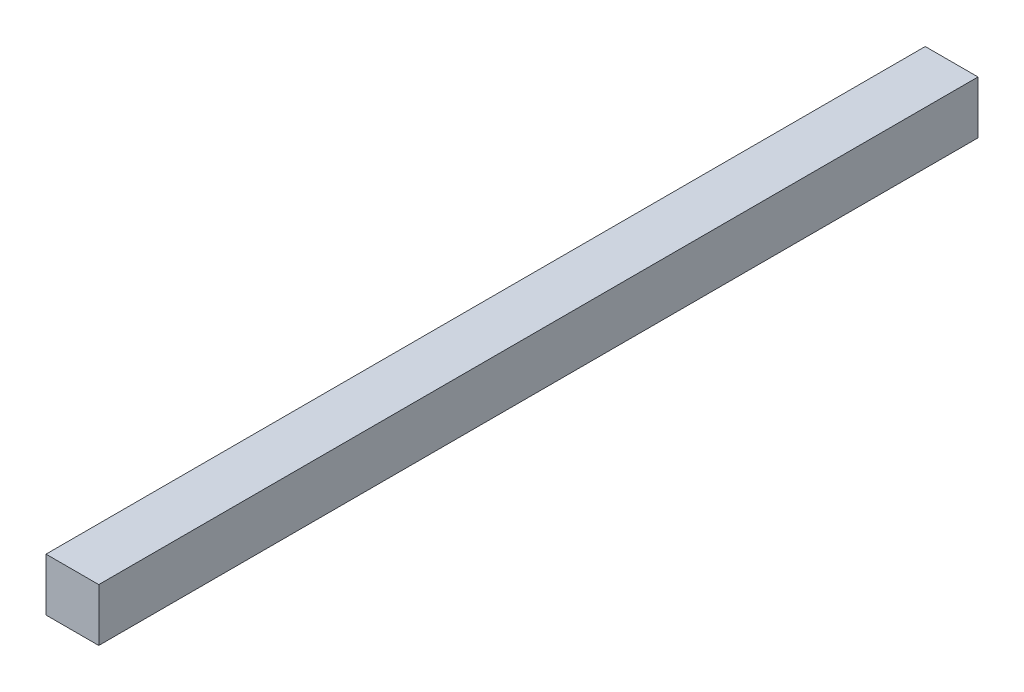
ISO-10303-21;
HEADER;
FILE_DESCRIPTION(('STEP AP214'),'2;1');
FILE_NAME('part.step','',(''),(''),'','','');
FILE_SCHEMA(('AUTOMOTIVE_DESIGN { 1 0 10303 214 1 1 1 1 }'));
ENDSEC;
DATA;
#1=APPLICATION_CONTEXT('core data for automotive mechanical design processes');
#2=APPLICATION_PROTOCOL_DEFINITION('international standard','automotive_design',2000,#1);
#3=PRODUCT_CONTEXT('',#1,'mechanical');
#4=PRODUCT('Part','Part','',(#3));
#5=PRODUCT_RELATED_PRODUCT_CATEGORY('part','',(#4));
#6=PRODUCT_DEFINITION_FORMATION('','',#4);
#7=PRODUCT_DEFINITION_CONTEXT('part definition',#1,'design');
#8=PRODUCT_DEFINITION('design','',#6,#7);
#9=PRODUCT_DEFINITION_SHAPE('','',#8);
#10=(LENGTH_UNIT() NAMED_UNIT(*) SI_UNIT(.MILLI.,.METRE.));
#11=(NAMED_UNIT(*) PLANE_ANGLE_UNIT() SI_UNIT($,.RADIAN.));
#12=(NAMED_UNIT(*) SI_UNIT($,.STERADIAN.) SOLID_ANGLE_UNIT());
#13=UNCERTAINTY_MEASURE_WITH_UNIT(LENGTH_MEASURE(1.E-05),#10,'distance_accuracy_value','');
#14=(GEOMETRIC_REPRESENTATION_CONTEXT(3) GLOBAL_UNCERTAINTY_ASSIGNED_CONTEXT((#13)) GLOBAL_UNIT_ASSIGNED_CONTEXT((#10,
#11,#12)) REPRESENTATION_CONTEXT('',''));
#15=CARTESIAN_POINT('',(0.,0.,0.));
#16=DIRECTION('',(0.,0.,1.));
#17=DIRECTION('',(1.,0.,0.));
#18=AXIS2_PLACEMENT_3D('',#15,#16,#17);
#19=CARTESIAN_POINT('',(-19.5762350936968,22.7172061328773,500.));
#20=DIRECTION('',(1.,0.,0.));
#21=DIRECTION('',(0.,1.,0.));
#22=AXIS2_PLACEMENT_3D('',#19,#20,#21);
#23=PLANE('',#22);
#24=DIRECTION('',(0.,-1.,0.));
#25=VECTOR('',#24,1.);
#26=CARTESIAN_POINT('',(-19.5762350936968,22.7172061328773,0.));
#27=LINE('',#26,#25);
#28=CARTESIAN_POINT('',(-19.5762350936968,22.7172061328773,0.));
#29=VERTEX_POINT('',#28);
#30=CARTESIAN_POINT('',(-19.5762350936968,-7.2827938671227,0.));
#31=VERTEX_POINT('',#30);
#32=EDGE_CURVE('E95',#29,#31,#27,.T.);
#33=ORIENTED_EDGE('',*,*,#32,.T.);
#34=DIRECTION('',(0.,0.,-1.));
#35=VECTOR('',#34,1.);
#36=CARTESIAN_POINT('',(-19.5762350936968,-7.2827938671227,500.));
#37=LINE('',#36,#35);
#38=CARTESIAN_POINT('',(-19.5762350936968,-7.2827938671227,500.));
#39=VERTEX_POINT('',#38);
#40=EDGE_CURVE('E11',#39,#31,#37,.T.);
#41=ORIENTED_EDGE('',*,*,#40,.F.);
#42=DIRECTION('',(0.,-1.,0.));
#43=VECTOR('',#42,1.);
#44=CARTESIAN_POINT('',(-19.5762350936968,22.7172061328773,500.));
#45=LINE('',#44,#43);
#46=CARTESIAN_POINT('',(-19.5762350936968,22.7172061328773,500.));
#47=VERTEX_POINT('',#46);
#48=EDGE_CURVE('E83',#47,#39,#45,.T.);
#49=ORIENTED_EDGE('',*,*,#48,.F.);
#50=DIRECTION('',(0.,0.,-1.));
#51=VECTOR('',#50,1.);
#52=CARTESIAN_POINT('',(-19.5762350936968,22.7172061328773,500.));
#53=LINE('',#52,#51);
#54=EDGE_CURVE('E91',#47,#29,#53,.T.);
#55=ORIENTED_EDGE('',*,*,#54,.T.);
#56=EDGE_LOOP('',(#33,#41,#49,#55));
#57=FACE_BOUND('',#56,.T.);
#58=ADVANCED_FACE('F32',(#57),#23,.F.);
#59=CARTESIAN_POINT('',(-19.5762350936968,-7.2827938671227,500.));
#60=DIRECTION('',(0.,1.,0.));
#61=DIRECTION('',(0.,0.,1.));
#62=AXIS2_PLACEMENT_3D('',#59,#60,#61);
#63=PLANE('',#62);
#64=DIRECTION('',(1.,0.,0.));
#65=VECTOR('',#64,1.);
#66=CARTESIAN_POINT('',(-19.5762350936968,-7.2827938671227,0.));
#67=LINE('',#66,#65);
#68=CARTESIAN_POINT('',(10.4237649063032,-7.2827938671227,0.));
#69=VERTEX_POINT('',#68);
#70=EDGE_CURVE('E87',#31,#69,#67,.T.);
#71=ORIENTED_EDGE('',*,*,#70,.T.);
#72=DIRECTION('',(0.,0.,-1.));
#73=VECTOR('',#72,1.);
#74=CARTESIAN_POINT('',(10.4237649063032,-7.2827938671227,500.));
#75=LINE('',#74,#73);
#76=CARTESIAN_POINT('',(10.4237649063032,-7.2827938671227,500.));
#77=VERTEX_POINT('',#76);
#78=EDGE_CURVE('E40',#77,#69,#75,.T.);
#79=ORIENTED_EDGE('',*,*,#78,.F.);
#80=DIRECTION('',(1.,0.,0.));
#81=VECTOR('',#80,1.);
#82=CARTESIAN_POINT('',(-19.5762350936968,-7.2827938671227,500.));
#83=LINE('',#82,#81);
#84=EDGE_CURVE('E78',#39,#77,#83,.T.);
#85=ORIENTED_EDGE('',*,*,#84,.F.);
#86=ORIENTED_EDGE('',*,*,#40,.T.);
#87=EDGE_LOOP('',(#71,#79,#85,#86));
#88=FACE_BOUND('',#87,.T.);
#89=ADVANCED_FACE('F86',(#88),#63,.F.);
#90=CARTESIAN_POINT('',(10.4237649063032,22.7172061328773,500.));
#91=DIRECTION('',(-1.,0.,0.));
#92=DIRECTION('',(0.,-1.,0.));
#93=AXIS2_PLACEMENT_3D('',#90,#91,#92);
#94=PLANE('',#93);
#95=DIRECTION('',(0.,1.,0.));
#96=VECTOR('',#95,1.);
#97=CARTESIAN_POINT('',(10.4237649063032,22.7172061328773,0.));
#98=LINE('',#97,#96);
#99=CARTESIAN_POINT('',(10.4237649063032,22.7172061328773,0.));
#100=VERTEX_POINT('',#99);
#101=EDGE_CURVE('E65',#69,#100,#98,.T.);
#102=ORIENTED_EDGE('',*,*,#101,.T.);
#103=DIRECTION('',(0.,0.,-1.));
#104=VECTOR('',#103,1.);
#105=CARTESIAN_POINT('',(10.4237649063032,22.7172061328773,500.));
#106=LINE('',#105,#104);
#107=CARTESIAN_POINT('',(10.4237649063032,22.7172061328773,500.));
#108=VERTEX_POINT('',#107);
#109=EDGE_CURVE('E88',#108,#100,#106,.T.);
#110=ORIENTED_EDGE('',*,*,#109,.F.);
#111=DIRECTION('',(0.,1.,0.));
#112=VECTOR('',#111,1.);
#113=CARTESIAN_POINT('',(10.4237649063032,22.7172061328773,500.));
#114=LINE('',#113,#112);
#115=EDGE_CURVE('E81',#77,#108,#114,.T.);
#116=ORIENTED_EDGE('',*,*,#115,.F.);
#117=ORIENTED_EDGE('',*,*,#78,.T.);
#118=EDGE_LOOP('',(#102,#110,#116,#117));
#119=FACE_BOUND('',#118,.T.);
#120=ADVANCED_FACE('F89',(#119),#94,.F.);
#121=CARTESIAN_POINT('',(-19.5762350936968,22.7172061328773,500.));
#122=DIRECTION('',(0.,-1.,0.));
#123=DIRECTION('',(0.,0.,-1.));
#124=AXIS2_PLACEMENT_3D('',#121,#122,#123);
#125=PLANE('',#124);
#126=DIRECTION('',(-1.,0.,0.));
#127=VECTOR('',#126,1.);
#128=CARTESIAN_POINT('',(-19.5762350936968,22.7172061328773,0.));
#129=LINE('',#128,#127);
#130=EDGE_CURVE('E71',#100,#29,#129,.T.);
#131=ORIENTED_EDGE('',*,*,#130,.T.);
#132=ORIENTED_EDGE('',*,*,#54,.F.);
#133=DIRECTION('',(-1.,0.,0.));
#134=VECTOR('',#133,1.);
#135=CARTESIAN_POINT('',(-19.5762350936968,22.7172061328773,500.));
#136=LINE('',#135,#134);
#137=EDGE_CURVE('E48',#108,#47,#136,.T.);
#138=ORIENTED_EDGE('',*,*,#137,.F.);
#139=ORIENTED_EDGE('',*,*,#109,.T.);
#140=EDGE_LOOP('',(#131,#132,#138,#139));
#141=FACE_BOUND('',#140,.T.);
#142=ADVANCED_FACE('F102',(#141),#125,.F.);
#143=CARTESIAN_POINT('',(0.,0.,500.));
#144=DIRECTION('',(0.,0.,1.));
#145=DIRECTION('',(1.,0.,0.));
#146=AXIS2_PLACEMENT_3D('',#143,#144,#145);
#147=PLANE('',#146);
#148=ORIENTED_EDGE('',*,*,#48,.T.);
#149=ORIENTED_EDGE('',*,*,#84,.T.);
#150=ORIENTED_EDGE('',*,*,#115,.T.);
#151=ORIENTED_EDGE('',*,*,#137,.T.);
#152=EDGE_LOOP('',(#148,#149,#150,#151));
#153=FACE_BOUND('',#152,.T.);
#154=ADVANCED_FACE('F79',(#153),#147,.T.);
#155=CARTESIAN_POINT('',(0.,0.,0.));
#156=DIRECTION('',(0.,0.,1.));
#157=DIRECTION('',(1.,0.,0.));
#158=AXIS2_PLACEMENT_3D('',#155,#156,#157);
#159=PLANE('',#158);
#160=ORIENTED_EDGE('',*,*,#32,.F.);
#161=ORIENTED_EDGE('',*,*,#130,.F.);
#162=ORIENTED_EDGE('',*,*,#101,.F.);
#163=ORIENTED_EDGE('',*,*,#70,.F.);
#164=EDGE_LOOP('',(#160,#161,#162,#163));
#165=FACE_BOUND('',#164,.T.);
#166=ADVANCED_FACE('F105',(#165),#159,.F.);
#167=CLOSED_SHELL('',(#58,#89,#120,#142,#154,#166));
#168=MANIFOLD_SOLID_BREP('B2',#167);
#169=ADVANCED_BREP_SHAPE_REPRESENTATION('',(#18,#168),#14);
#170=SHAPE_DEFINITION_REPRESENTATION(#9,#169);
ENDSEC;
END-ISO-10303-21;
